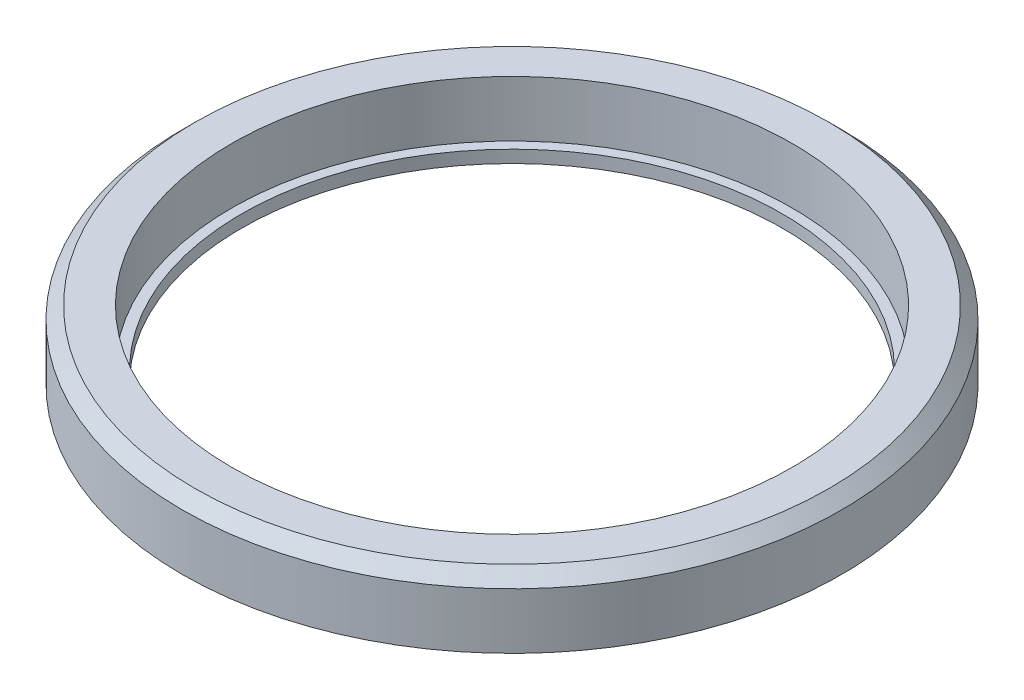
ISO-10303-21;
HEADER;
FILE_DESCRIPTION(('STEP AP214'),'2;1');
FILE_NAME('part.step','',(''),(''),'','','');
FILE_SCHEMA(('AUTOMOTIVE_DESIGN { 1 0 10303 214 1 1 1 1 }'));
ENDSEC;
DATA;
#1=APPLICATION_CONTEXT('core data for automotive mechanical design processes');
#2=APPLICATION_PROTOCOL_DEFINITION('international standard','automotive_design',2000,#1);
#3=PRODUCT_CONTEXT('',#1,'mechanical');
#4=PRODUCT('Part','Part','',(#3));
#5=PRODUCT_RELATED_PRODUCT_CATEGORY('part','',(#4));
#6=PRODUCT_DEFINITION_FORMATION('','',#4);
#7=PRODUCT_DEFINITION_CONTEXT('part definition',#1,'design');
#8=PRODUCT_DEFINITION('design','',#6,#7);
#9=PRODUCT_DEFINITION_SHAPE('','',#8);
#10=(LENGTH_UNIT() NAMED_UNIT(*) SI_UNIT(.MILLI.,.METRE.));
#11=(NAMED_UNIT(*) PLANE_ANGLE_UNIT() SI_UNIT($,.RADIAN.));
#12=(NAMED_UNIT(*) SI_UNIT($,.STERADIAN.) SOLID_ANGLE_UNIT());
#13=UNCERTAINTY_MEASURE_WITH_UNIT(LENGTH_MEASURE(1.E-05),#10,'distance_accuracy_value','');
#14=(GEOMETRIC_REPRESENTATION_CONTEXT(3) GLOBAL_UNCERTAINTY_ASSIGNED_CONTEXT((#13)) GLOBAL_UNIT_ASSIGNED_CONTEXT((#10,
#11,#12)) REPRESENTATION_CONTEXT('',''));
#15=CARTESIAN_POINT('',(0.,0.,0.));
#16=DIRECTION('',(0.,0.,1.));
#17=DIRECTION('',(1.,0.,0.));
#18=AXIS2_PLACEMENT_3D('',#15,#16,#17);
#19=CARTESIAN_POINT('',(0.,11.,0.));
#20=DIRECTION('',(0.,-1.,0.));
#21=DIRECTION('',(0.,0.,-1.));
#22=AXIS2_PLACEMENT_3D('',#19,#20,#21);
#23=CYLINDRICAL_SURFACE('',#22,43.5);
#24=CARTESIAN_POINT('',(0.,0.,0.));
#25=DIRECTION('',(0.,1.,0.));
#26=DIRECTION('',(0.,0.,1.));
#27=AXIS2_PLACEMENT_3D('',#24,#25,#26);
#28=CIRCLE('',#27,43.5);
#29=CARTESIAN_POINT('',(0.,0.,43.5));
#30=VERTEX_POINT('',#29);
#31=EDGE_CURVE('E46',#30,#30,#28,.T.);
#32=ORIENTED_EDGE('',*,*,#31,.F.);
#33=EDGE_LOOP('',(#32));
#34=FACE_BOUND('',#33,.T.);
#35=CARTESIAN_POINT('',(0.,2.,0.));
#36=DIRECTION('',(0.,1.,0.));
#37=DIRECTION('',(0.,0.,1.));
#38=AXIS2_PLACEMENT_3D('',#35,#36,#37);
#39=CIRCLE('',#38,43.5);
#40=CARTESIAN_POINT('',(0.,2.,43.5));
#41=VERTEX_POINT('',#40);
#42=EDGE_CURVE('E49',#41,#41,#39,.T.);
#43=ORIENTED_EDGE('',*,*,#42,.T.);
#44=EDGE_LOOP('',(#43));
#45=FACE_BOUND('',#44,.T.);
#46=ADVANCED_FACE('F31',(#34,#45),#23,.F.);
#47=CARTESIAN_POINT('',(0.,11.,0.));
#48=DIRECTION('',(0.,1.,0.));
#49=DIRECTION('',(0.,0.,1.));
#50=AXIS2_PLACEMENT_3D('',#47,#48,#49);
#51=PLANE('',#50);
#52=CARTESIAN_POINT('',(0.,11.,0.));
#53=DIRECTION('',(0.,1.,0.));
#54=DIRECTION('',(0.,0.,1.));
#55=AXIS2_PLACEMENT_3D('',#52,#53,#54);
#56=CIRCLE('',#55,51.);
#57=CARTESIAN_POINT('',(0.,11.,51.));
#58=VERTEX_POINT('',#57);
#59=EDGE_CURVE('E38',#58,#58,#56,.T.);
#60=ORIENTED_EDGE('',*,*,#59,.T.);
#61=EDGE_LOOP('',(#60));
#62=FACE_BOUND('',#61,.T.);
#63=CARTESIAN_POINT('',(0.,11.,0.));
#64=DIRECTION('',(0.,1.,0.));
#65=DIRECTION('',(0.,0.,1.));
#66=AXIS2_PLACEMENT_3D('',#63,#64,#65);
#67=CIRCLE('',#66,45.1);
#68=CARTESIAN_POINT('',(0.,11.,45.1));
#69=VERTEX_POINT('',#68);
#70=EDGE_CURVE('E55',#69,#69,#67,.T.);
#71=ORIENTED_EDGE('',*,*,#70,.F.);
#72=EDGE_LOOP('',(#71));
#73=FACE_BOUND('',#72,.T.);
#74=ADVANCED_FACE('F70',(#62,#73),#51,.T.);
#75=CARTESIAN_POINT('',(0.,0.,0.));
#76=DIRECTION('',(0.,1.,0.));
#77=DIRECTION('',(0.,0.,1.));
#78=AXIS2_PLACEMENT_3D('',#75,#76,#77);
#79=PLANE('',#78);
#80=CARTESIAN_POINT('',(0.,0.,0.));
#81=DIRECTION('',(0.,1.,0.));
#82=DIRECTION('',(0.,0.,1.));
#83=AXIS2_PLACEMENT_3D('',#80,#81,#82);
#84=CIRCLE('',#83,53.);
#85=CARTESIAN_POINT('',(0.,0.,53.));
#86=VERTEX_POINT('',#85);
#87=EDGE_CURVE('E42',#86,#86,#84,.T.);
#88=ORIENTED_EDGE('',*,*,#87,.F.);
#89=EDGE_LOOP('',(#88));
#90=FACE_BOUND('',#89,.T.);
#91=ORIENTED_EDGE('',*,*,#31,.T.);
#92=EDGE_LOOP('',(#91));
#93=FACE_BOUND('',#92,.T.);
#94=ADVANCED_FACE('F72',(#90,#93),#79,.F.);
#95=CARTESIAN_POINT('',(0.,11.,0.));
#96=DIRECTION('',(0.,-1.,0.));
#97=DIRECTION('',(0.,0.,-1.));
#98=AXIS2_PLACEMENT_3D('',#95,#96,#97);
#99=CYLINDRICAL_SURFACE('',#98,53.);
#100=CARTESIAN_POINT('',(0.,9.00000000000001,0.));
#101=DIRECTION('',(0.,1.,0.));
#102=DIRECTION('',(0.,0.,1.));
#103=AXIS2_PLACEMENT_3D('',#100,#101,#102);
#104=CIRCLE('',#103,53.);
#105=CARTESIAN_POINT('',(0.,9.00000000000001,53.));
#106=VERTEX_POINT('',#105);
#107=EDGE_CURVE('E10',#106,#106,#104,.F.);
#108=ORIENTED_EDGE('',*,*,#107,.T.);
#109=EDGE_LOOP('',(#108));
#110=FACE_BOUND('',#109,.T.);
#111=ORIENTED_EDGE('',*,*,#87,.T.);
#112=EDGE_LOOP('',(#111));
#113=FACE_BOUND('',#112,.T.);
#114=ADVANCED_FACE('F66',(#110,#113),#99,.T.);
#115=CARTESIAN_POINT('',(0.,2.,0.));
#116=DIRECTION('',(0.,1.,0.));
#117=DIRECTION('',(0.,0.,1.));
#118=AXIS2_PLACEMENT_3D('',#115,#116,#117);
#119=CYLINDRICAL_SURFACE('',#118,45.1);
#120=CARTESIAN_POINT('',(0.,2.,0.));
#121=DIRECTION('',(0.,1.,0.));
#122=DIRECTION('',(0.,0.,1.));
#123=AXIS2_PLACEMENT_3D('',#120,#121,#122);
#124=CIRCLE('',#123,45.1);
#125=CARTESIAN_POINT('',(0.,2.,45.1));
#126=VERTEX_POINT('',#125);
#127=EDGE_CURVE('E51',#126,#126,#124,.T.);
#128=ORIENTED_EDGE('',*,*,#127,.F.);
#129=EDGE_LOOP('',(#128));
#130=FACE_BOUND('',#129,.T.);
#131=ORIENTED_EDGE('',*,*,#70,.T.);
#132=EDGE_LOOP('',(#131));
#133=FACE_BOUND('',#132,.T.);
#134=ADVANCED_FACE('F63',(#130,#133),#119,.F.);
#135=CARTESIAN_POINT('',(0.,2.,0.));
#136=DIRECTION('',(0.,1.,0.));
#137=DIRECTION('',(0.,0.,1.));
#138=AXIS2_PLACEMENT_3D('',#135,#136,#137);
#139=PLANE('',#138);
#140=ORIENTED_EDGE('',*,*,#42,.F.);
#141=EDGE_LOOP('',(#140));
#142=FACE_BOUND('',#141,.T.);
#143=ORIENTED_EDGE('',*,*,#127,.T.);
#144=EDGE_LOOP('',(#143));
#145=FACE_BOUND('',#144,.T.);
#146=ADVANCED_FACE('F61',(#142,#145),#139,.T.);
#147=CARTESIAN_POINT('',(0.,11.,0.));
#148=DIRECTION('',(0.,-1.,0.));
#149=DIRECTION('',(0.,0.,-1.));
#150=AXIS2_PLACEMENT_3D('',#147,#148,#149);
#151=CONICAL_SURFACE('',#150,51.,0.785398163397447);
#152=ORIENTED_EDGE('',*,*,#107,.F.);
#153=EDGE_LOOP('',(#152));
#154=FACE_BOUND('',#153,.T.);
#155=ORIENTED_EDGE('',*,*,#59,.F.);
#156=EDGE_LOOP('',(#155));
#157=FACE_BOUND('',#156,.T.);
#158=ADVANCED_FACE('F33',(#154,#157),#151,.T.);
#159=CLOSED_SHELL('',(#46,#74,#94,#114,#134,#146,#158));
#160=MANIFOLD_SOLID_BREP('B2',#159);
#161=ADVANCED_BREP_SHAPE_REPRESENTATION('',(#18,#160),#14);
#162=SHAPE_DEFINITION_REPRESENTATION(#9,#161);
ENDSEC;
END-ISO-10303-21;
